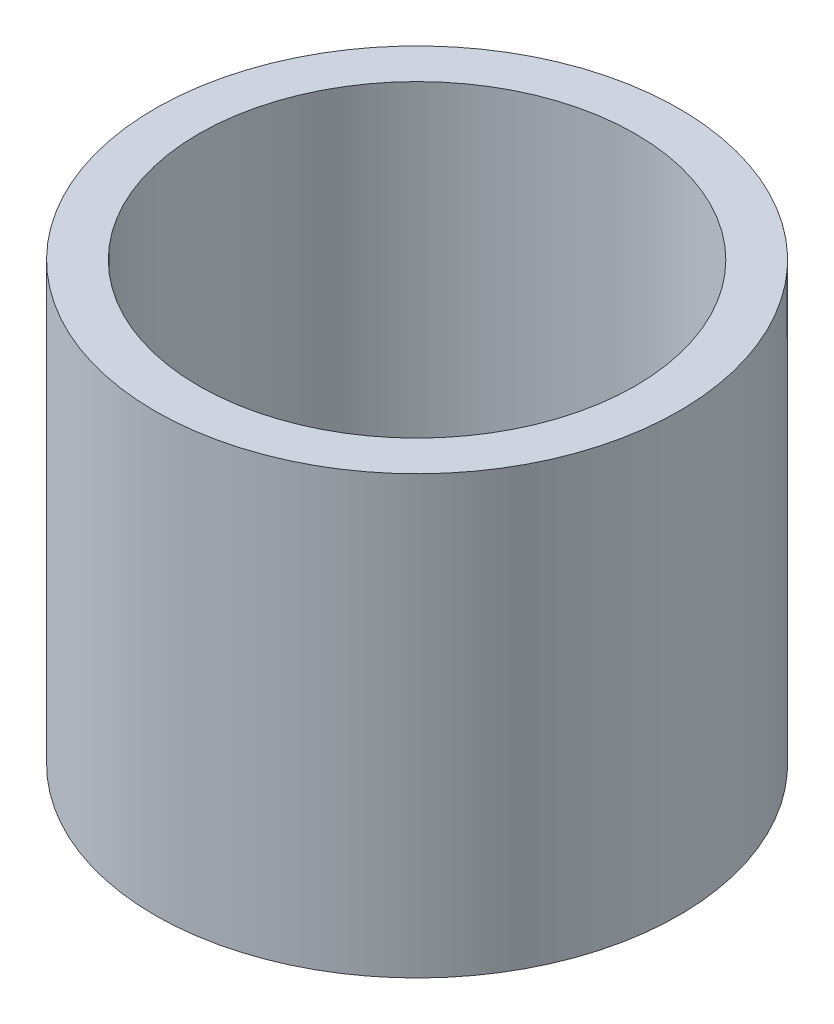
ISO-10303-21;
HEADER;
FILE_DESCRIPTION(('STEP AP214'),'2;1');
FILE_NAME('part.step','',(''),(''),'','','');
FILE_SCHEMA(('AUTOMOTIVE_DESIGN { 1 0 10303 214 1 1 1 1 }'));
ENDSEC;
DATA;
#1=APPLICATION_CONTEXT('core data for automotive mechanical design processes');
#2=APPLICATION_PROTOCOL_DEFINITION('international standard','automotive_design',2000,#1);
#3=PRODUCT_CONTEXT('',#1,'mechanical');
#4=PRODUCT('Part','Part','',(#3));
#5=PRODUCT_RELATED_PRODUCT_CATEGORY('part','',(#4));
#6=PRODUCT_DEFINITION_FORMATION('','',#4);
#7=PRODUCT_DEFINITION_CONTEXT('part definition',#1,'design');
#8=PRODUCT_DEFINITION('design','',#6,#7);
#9=PRODUCT_DEFINITION_SHAPE('','',#8);
#10=(LENGTH_UNIT() NAMED_UNIT(*) SI_UNIT(.MILLI.,.METRE.));
#11=(NAMED_UNIT(*) PLANE_ANGLE_UNIT() SI_UNIT($,.RADIAN.));
#12=(NAMED_UNIT(*) SI_UNIT($,.STERADIAN.) SOLID_ANGLE_UNIT());
#13=UNCERTAINTY_MEASURE_WITH_UNIT(LENGTH_MEASURE(1.E-05),#10,'distance_accuracy_value','');
#14=(GEOMETRIC_REPRESENTATION_CONTEXT(3) GLOBAL_UNCERTAINTY_ASSIGNED_CONTEXT((#13)) GLOBAL_UNIT_ASSIGNED_CONTEXT((#10,
#11,#12)) REPRESENTATION_CONTEXT('',''));
#15=CARTESIAN_POINT('',(0.,0.,0.));
#16=DIRECTION('',(0.,0.,1.));
#17=DIRECTION('',(1.,0.,0.));
#18=AXIS2_PLACEMENT_3D('',#15,#16,#17);
#19=CARTESIAN_POINT('',(-3.,0.,0.));
#20=DIRECTION('',(0.,-1.,0.));
#21=DIRECTION('',(0.,0.,-1.));
#22=AXIS2_PLACEMENT_3D('',#19,#20,#21);
#23=PLANE('',#22);
#24=CARTESIAN_POINT('',(0.,0.,0.));
#25=DIRECTION('',(0.,1.,0.));
#26=DIRECTION('',(0.,0.,1.));
#27=AXIS2_PLACEMENT_3D('',#24,#25,#26);
#28=CIRCLE('',#27,2.5);
#29=CARTESIAN_POINT('',(0.,0.,2.5));
#30=VERTEX_POINT('',#29);
#31=EDGE_CURVE('E10',#30,#30,#28,.T.);
#32=ORIENTED_EDGE('',*,*,#31,.T.);
#33=EDGE_LOOP('',(#32));
#34=FACE_BOUND('',#33,.T.);
#35=CARTESIAN_POINT('',(0.,0.,0.));
#36=DIRECTION('',(0.,1.,0.));
#37=DIRECTION('',(0.,0.,1.));
#38=AXIS2_PLACEMENT_3D('',#35,#36,#37);
#39=CIRCLE('',#38,3.);
#40=CARTESIAN_POINT('',(0.,0.,3.));
#41=VERTEX_POINT('',#40);
#42=EDGE_CURVE('E60',#41,#41,#39,.T.);
#43=ORIENTED_EDGE('',*,*,#42,.F.);
#44=EDGE_LOOP('',(#43));
#45=FACE_BOUND('',#44,.T.);
#46=ADVANCED_FACE('F43',(#34,#45),#23,.T.);
#47=CARTESIAN_POINT('',(0.,12.4513332605531,0.));
#48=DIRECTION('',(0.,1.,0.));
#49=DIRECTION('',(0.,0.,1.));
#50=AXIS2_PLACEMENT_3D('',#47,#48,#49);
#51=CYLINDRICAL_SURFACE('',#50,2.5);
#52=CARTESIAN_POINT('',(0.,5.,0.));
#53=DIRECTION('',(0.,1.,0.));
#54=DIRECTION('',(0.,0.,1.));
#55=AXIS2_PLACEMENT_3D('',#52,#53,#54);
#56=CIRCLE('',#55,2.5);
#57=CARTESIAN_POINT('',(0.,5.,2.5));
#58=VERTEX_POINT('',#57);
#59=EDGE_CURVE('E50',#58,#58,#56,.T.);
#60=ORIENTED_EDGE('',*,*,#59,.T.);
#61=EDGE_LOOP('',(#60));
#62=FACE_BOUND('',#61,.T.);
#63=ORIENTED_EDGE('',*,*,#31,.F.);
#64=EDGE_LOOP('',(#63));
#65=FACE_BOUND('',#64,.T.);
#66=ADVANCED_FACE('F71',(#62,#65),#51,.F.);
#67=CARTESIAN_POINT('',(-3.,5.,0.));
#68=DIRECTION('',(0.,1.,0.));
#69=DIRECTION('',(0.,0.,1.));
#70=AXIS2_PLACEMENT_3D('',#67,#68,#69);
#71=PLANE('',#70);
#72=CARTESIAN_POINT('',(0.,5.,0.));
#73=DIRECTION('',(0.,1.,0.));
#74=DIRECTION('',(0.,0.,1.));
#75=AXIS2_PLACEMENT_3D('',#72,#73,#74);
#76=CIRCLE('',#75,3.);
#77=CARTESIAN_POINT('',(0.,5.,3.));
#78=VERTEX_POINT('',#77);
#79=EDGE_CURVE('E55',#78,#78,#76,.T.);
#80=ORIENTED_EDGE('',*,*,#79,.T.);
#81=EDGE_LOOP('',(#80));
#82=FACE_BOUND('',#81,.T.);
#83=ORIENTED_EDGE('',*,*,#59,.F.);
#84=EDGE_LOOP('',(#83));
#85=FACE_BOUND('',#84,.T.);
#86=ADVANCED_FACE('F75',(#82,#85),#71,.T.);
#87=CARTESIAN_POINT('',(0.,12.4513332605531,0.));
#88=DIRECTION('',(0.,1.,0.));
#89=DIRECTION('',(0.,0.,1.));
#90=AXIS2_PLACEMENT_3D('',#87,#88,#89);
#91=CYLINDRICAL_SURFACE('',#90,3.);
#92=ORIENTED_EDGE('',*,*,#42,.T.);
#93=EDGE_LOOP('',(#92));
#94=FACE_BOUND('',#93,.T.);
#95=ORIENTED_EDGE('',*,*,#79,.F.);
#96=EDGE_LOOP('',(#95));
#97=FACE_BOUND('',#96,.T.);
#98=ADVANCED_FACE('F67',(#94,#97),#91,.T.);
#99=CLOSED_SHELL('',(#46,#66,#86,#98));
#100=MANIFOLD_SOLID_BREP('B2',#99);
#101=ADVANCED_BREP_SHAPE_REPRESENTATION('',(#18,#100),#14);
#102=SHAPE_DEFINITION_REPRESENTATION(#9,#101);
ENDSEC;
END-ISO-10303-21;
